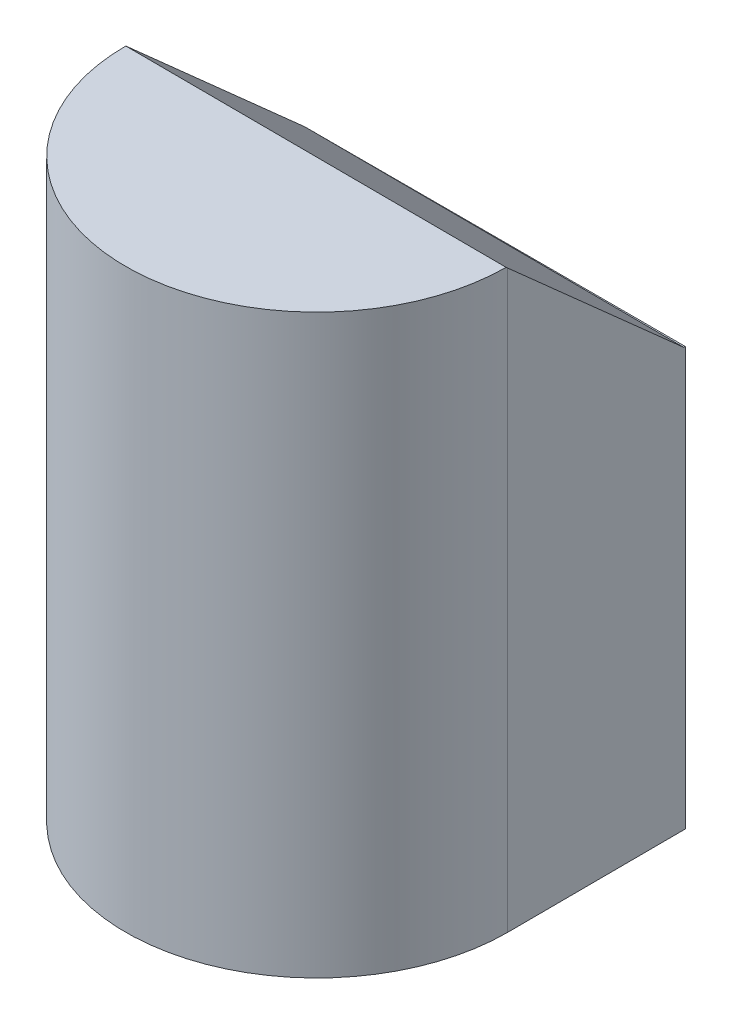
ISO-10303-21;
HEADER;
FILE_DESCRIPTION(('STEP AP214'),'2;1');
FILE_NAME('part.step','',(''),(''),'','','');
FILE_SCHEMA(('AUTOMOTIVE_DESIGN { 1 0 10303 214 1 1 1 1 }'));
ENDSEC;
DATA;
#1=APPLICATION_CONTEXT('core data for automotive mechanical design processes');
#2=APPLICATION_PROTOCOL_DEFINITION('international standard','automotive_design',2000,#1);
#3=PRODUCT_CONTEXT('',#1,'mechanical');
#4=PRODUCT('Part','Part','',(#3));
#5=PRODUCT_RELATED_PRODUCT_CATEGORY('part','',(#4));
#6=PRODUCT_DEFINITION_FORMATION('','',#4);
#7=PRODUCT_DEFINITION_CONTEXT('part definition',#1,'design');
#8=PRODUCT_DEFINITION('design','',#6,#7);
#9=PRODUCT_DEFINITION_SHAPE('','',#8);
#10=(LENGTH_UNIT() NAMED_UNIT(*) SI_UNIT(.MILLI.,.METRE.));
#11=(NAMED_UNIT(*) PLANE_ANGLE_UNIT() SI_UNIT($,.RADIAN.));
#12=(NAMED_UNIT(*) SI_UNIT($,.STERADIAN.) SOLID_ANGLE_UNIT());
#13=UNCERTAINTY_MEASURE_WITH_UNIT(LENGTH_MEASURE(1.E-05),#10,'distance_accuracy_value','');
#14=(GEOMETRIC_REPRESENTATION_CONTEXT(3) GLOBAL_UNCERTAINTY_ASSIGNED_CONTEXT((#13)) GLOBAL_UNIT_ASSIGNED_CONTEXT((#10,
#11,#12)) REPRESENTATION_CONTEXT('',''));
#15=CARTESIAN_POINT('',(0.,0.,0.));
#16=DIRECTION('',(0.,0.,1.));
#17=DIRECTION('',(1.,0.,0.));
#18=AXIS2_PLACEMENT_3D('',#15,#16,#17);
#19=CARTESIAN_POINT('',(54.4059295051279,164.30625,-0.217623718020512));
#20=DIRECTION('',(-0.999992000095999,0.,0.00399996800038401));
#21=DIRECTION('',(0.00399996800038401,0.,0.999992000095999));
#22=AXIS2_PLACEMENT_3D('',#19,#20,#21);
#23=PLANE('',#22);
#24=DIRECTION('',(-0.00399996800038401,0.,-0.999992000095999));
#25=VECTOR('',#24,1.);
#26=CARTESIAN_POINT('',(54.4059295051279,119.0752,-0.217623718020512));
#27=LINE('',#26,#25);
#28=CARTESIAN_POINT('',(54.2053345429527,119.0752,-50.3663642618282));
#29=VERTEX_POINT('',#28);
#30=CARTESIAN_POINT('',(54.2036,119.0752,-50.8));
#31=VERTEX_POINT('',#30);
#32=EDGE_CURVE('E93',#29,#31,#27,.T.);
#33=ORIENTED_EDGE('',*,*,#32,.F.);
#34=DIRECTION('',(-0.00298746066915277,-0.664968793982345,-0.74686516728819));
#35=VECTOR('',#34,1.);
#36=CARTESIAN_POINT('',(54.407084285163,163.981994639703,0.0710712907474984));
#37=LINE('',#36,#35);
#38=CARTESIAN_POINT('',(54.4068,163.918716564135,0.));
#39=VERTEX_POINT('',#38);
#40=EDGE_CURVE('E97',#39,#29,#37,.T.);
#41=ORIENTED_EDGE('',*,*,#40,.F.);
#42=DIRECTION('',(0.,-1.,0.));
#43=VECTOR('',#42,1.);
#44=CARTESIAN_POINT('',(54.4068,164.30625,0.));
#45=LINE('',#44,#43);
#46=CARTESIAN_POINT('',(54.4068,0.,0.));
#47=VERTEX_POINT('',#46);
#48=EDGE_CURVE('E126',#39,#47,#45,.T.);
#49=ORIENTED_EDGE('',*,*,#48,.T.);
#50=DIRECTION('',(-0.00399996800038401,0.,-0.999992000095999));
#51=VECTOR('',#50,1.);
#52=CARTESIAN_POINT('',(54.4059295051279,0.,-0.217623718020512));
#53=LINE('',#52,#51);
#54=CARTESIAN_POINT('',(54.2036,0.,-50.8));
#55=VERTEX_POINT('',#54);
#56=EDGE_CURVE('E120',#47,#55,#53,.T.);
#57=ORIENTED_EDGE('',*,*,#56,.T.);
#58=DIRECTION('',(0.,-1.,0.));
#59=VECTOR('',#58,1.);
#60=CARTESIAN_POINT('',(54.2036,164.30625,-50.8));
#61=LINE('',#60,#59);
#62=EDGE_CURVE('E63',#31,#55,#61,.T.);
#63=ORIENTED_EDGE('',*,*,#62,.F.);
#64=EDGE_LOOP('',(#33,#41,#49,#57,#63));
#65=FACE_BOUND('',#64,.T.);
#66=ADVANCED_FACE('F40',(#65),#23,.F.);
#67=CARTESIAN_POINT('',(0.,164.30625,-50.8));
#68=DIRECTION('',(0.,0.,-1.));
#69=DIRECTION('',(-1.,0.,0.));
#70=AXIS2_PLACEMENT_3D('',#67,#68,#69);
#71=PLANE('',#70);
#72=DIRECTION('',(0.,-1.,0.));
#73=VECTOR('',#72,1.);
#74=CARTESIAN_POINT('',(-54.2036,164.30625,-50.8));
#75=LINE('',#74,#73);
#76=CARTESIAN_POINT('',(-54.2036,119.0752,-50.8));
#77=VERTEX_POINT('',#76);
#78=CARTESIAN_POINT('',(-54.2036,0.,-50.8));
#79=VERTEX_POINT('',#78);
#80=EDGE_CURVE('E55',#77,#79,#75,.T.);
#81=ORIENTED_EDGE('',*,*,#80,.F.);
#82=DIRECTION('',(1.,0.,0.));
#83=VECTOR('',#82,1.);
#84=CARTESIAN_POINT('',(0.,119.0752,-50.8));
#85=LINE('',#84,#83);
#86=EDGE_CURVE('E94',#77,#31,#85,.T.);
#87=ORIENTED_EDGE('',*,*,#86,.T.);
#88=ORIENTED_EDGE('',*,*,#62,.T.);
#89=DIRECTION('',(1.,0.,0.));
#90=VECTOR('',#89,1.);
#91=CARTESIAN_POINT('',(0.,0.,-50.8));
#92=LINE('',#91,#90);
#93=EDGE_CURVE('E115',#79,#55,#92,.T.);
#94=ORIENTED_EDGE('',*,*,#93,.F.);
#95=EDGE_LOOP('',(#81,#87,#88,#94));
#96=FACE_BOUND('',#95,.T.);
#97=ADVANCED_FACE('F136',(#96),#71,.T.);
#98=CARTESIAN_POINT('',(-54.4059295051279,164.30625,-0.217623718020512));
#99=DIRECTION('',(-0.999992000095999,0.,-0.00399996800038401));
#100=DIRECTION('',(-0.00399996800038401,0.,0.999992000095999));
#101=AXIS2_PLACEMENT_3D('',#98,#99,#100);
#102=PLANE('',#101);
#103=DIRECTION('',(0.,-1.,0.));
#104=VECTOR('',#103,1.);
#105=CARTESIAN_POINT('',(-54.4068,164.30625,0.));
#106=LINE('',#105,#104);
#107=CARTESIAN_POINT('',(-54.4068,164.30625,0.));
#108=VERTEX_POINT('',#107);
#109=CARTESIAN_POINT('',(-54.4068,0.,0.));
#110=VERTEX_POINT('',#109);
#111=EDGE_CURVE('E48',#108,#110,#106,.T.);
#112=ORIENTED_EDGE('',*,*,#111,.F.);
#113=DIRECTION('',(0.00298741839651149,-0.664980663698479,-0.746854599127872));
#114=VECTOR('',#113,1.);
#115=CARTESIAN_POINT('',(-54.0799076718378,91.5420608281467,-81.7230820405484));
#116=LINE('',#115,#114);
#117=EDGE_CURVE('E98',#108,#77,#116,.T.);
#118=ORIENTED_EDGE('',*,*,#117,.T.);
#119=ORIENTED_EDGE('',*,*,#80,.T.);
#120=DIRECTION('',(0.00399996800038401,0.,-0.999992000095999));
#121=VECTOR('',#120,1.);
#122=CARTESIAN_POINT('',(-54.4059295051279,0.,-0.217623718020512));
#123=LINE('',#122,#121);
#124=EDGE_CURVE('E108',#110,#79,#123,.T.);
#125=ORIENTED_EDGE('',*,*,#124,.F.);
#126=EDGE_LOOP('',(#112,#118,#119,#125));
#127=FACE_BOUND('',#126,.T.);
#128=ADVANCED_FACE('F42',(#127),#102,.T.);
#129=CARTESIAN_POINT('',(0.,164.30625,0.));
#130=DIRECTION('',(0.,-1.,0.));
#131=DIRECTION('',(0.,0.,-1.));
#132=AXIS2_PLACEMENT_3D('',#129,#130,#131);
#133=CYLINDRICAL_SURFACE('',#132,54.4068);
#134=CARTESIAN_POINT('',(0.,164.112483282067,0.));
#135=DIRECTION('',(0.00265990137566804,0.746860573940766,-0.664975343917007));
#136=DIRECTION('',(0.0029874183965115,-0.664980663698479,-0.746854599127872));
#137=AXIS2_PLACEMENT_3D('',#134,#135,#136);
#138=ELLIPSE('',#137,72.8473317488507,54.4068);
#139=CARTESIAN_POINT('',(54.4050590102558,164.30625,0.435247436041025));
#140=VERTEX_POINT('',#139);
#141=EDGE_CURVE('E106',#140,#39,#138,.T.);
#142=ORIENTED_EDGE('',*,*,#141,.F.);
#143=CARTESIAN_POINT('',(0.,164.30625,0.));
#144=DIRECTION('',(0.,1.,0.));
#145=DIRECTION('',(0.,0.,1.));
#146=AXIS2_PLACEMENT_3D('',#143,#144,#145);
#147=CIRCLE('',#146,54.4068);
#148=EDGE_CURVE('E112',#108,#140,#147,.T.);
#149=ORIENTED_EDGE('',*,*,#148,.F.);
#150=ORIENTED_EDGE('',*,*,#111,.T.);
#151=CARTESIAN_POINT('',(0.,0.,0.));
#152=DIRECTION('',(0.,1.,0.));
#153=DIRECTION('',(0.,0.,1.));
#154=AXIS2_PLACEMENT_3D('',#151,#152,#153);
#155=CIRCLE('',#154,54.4068);
#156=EDGE_CURVE('E117',#110,#47,#155,.T.);
#157=ORIENTED_EDGE('',*,*,#156,.T.);
#158=ORIENTED_EDGE('',*,*,#48,.F.);
#159=EDGE_LOOP('',(#142,#149,#150,#157,#158));
#160=FACE_BOUND('',#159,.T.);
#161=ADVANCED_FACE('F131',(#160),#133,.T.);
#162=CARTESIAN_POINT('',(0.,164.30625,0.));
#163=DIRECTION('',(0.,1.,0.));
#164=DIRECTION('',(0.,0.,1.));
#165=AXIS2_PLACEMENT_3D('',#162,#163,#164);
#166=PLANE('',#165);
#167=ORIENTED_EDGE('',*,*,#148,.T.);
#168=DIRECTION('',(-0.999992000095999,0.,-0.00399996800038401));
#169=VECTOR('',#168,1.);
#170=CARTESIAN_POINT('',(-0.000870494872082152,164.30625,0.217623718020537));
#171=LINE('',#170,#169);
#172=EDGE_CURVE('E11',#140,#108,#171,.T.);
#173=ORIENTED_EDGE('',*,*,#172,.T.);
#174=EDGE_LOOP('',(#167,#173));
#175=FACE_BOUND('',#174,.T.);
#176=ADVANCED_FACE('F142',(#175),#166,.T.);
#177=CARTESIAN_POINT('',(0.,0.,0.));
#178=DIRECTION('',(0.,1.,0.));
#179=DIRECTION('',(0.,0.,1.));
#180=AXIS2_PLACEMENT_3D('',#177,#178,#179);
#181=PLANE('',#180);
#182=ORIENTED_EDGE('',*,*,#124,.T.);
#183=ORIENTED_EDGE('',*,*,#93,.T.);
#184=ORIENTED_EDGE('',*,*,#56,.F.);
#185=ORIENTED_EDGE('',*,*,#156,.F.);
#186=EDGE_LOOP('',(#182,#183,#184,#185));
#187=FACE_BOUND('',#186,.T.);
#188=ADVANCED_FACE('F134',(#187),#181,.F.);
#189=CARTESIAN_POINT('',(54.9495750564386,91.5420608281467,-81.2869641096353));
#190=DIRECTION('',(0.00265990137566804,0.746860573940766,-0.664975343917007));
#191=DIRECTION('',(0.,0.664977696304814,0.746863216002196));
#192=AXIS2_PLACEMENT_3D('',#189,#190,#191);
#193=PLANE('',#192);
#194=ORIENTED_EDGE('',*,*,#141,.T.);
#195=ORIENTED_EDGE('',*,*,#40,.T.);
#196=DIRECTION('',(-0.999992000095999,0.,-0.00399996800038401));
#197=VECTOR('',#196,1.);
#198=CARTESIAN_POINT('',(54.8258827282764,119.0752,-50.3638820690869));
#199=LINE('',#198,#197);
#200=EDGE_CURVE('E90',#29,#77,#199,.T.);
#201=ORIENTED_EDGE('',*,*,#200,.T.);
#202=ORIENTED_EDGE('',*,*,#117,.F.);
#203=ORIENTED_EDGE('',*,*,#172,.F.);
#204=EDGE_LOOP('',(#194,#195,#201,#202,#203));
#205=FACE_BOUND('',#204,.T.);
#206=ADVANCED_FACE('F104',(#205),#193,.T.);
#207=CARTESIAN_POINT('',(54.6235532231484,119.0752,0.218494212892594));
#208=DIRECTION('',(0.,1.,0.));
#209=DIRECTION('',(0.,0.,1.));
#210=AXIS2_PLACEMENT_3D('',#207,#208,#209);
#211=PLANE('',#210);
#212=ORIENTED_EDGE('',*,*,#32,.T.);
#213=ORIENTED_EDGE('',*,*,#86,.F.);
#214=ORIENTED_EDGE('',*,*,#200,.F.);
#215=EDGE_LOOP('',(#212,#213,#214));
#216=FACE_BOUND('',#215,.T.);
#217=ADVANCED_FACE('F92',(#216),#211,.T.);
#218=CLOSED_SHELL('',(#66,#97,#128,#161,#176,#188,#206,#217));
#219=MANIFOLD_SOLID_BREP('B2',#218);
#220=ADVANCED_BREP_SHAPE_REPRESENTATION('',(#18,#219),#14);
#221=SHAPE_DEFINITION_REPRESENTATION(#9,#220);
ENDSEC;
END-ISO-10303-21;
